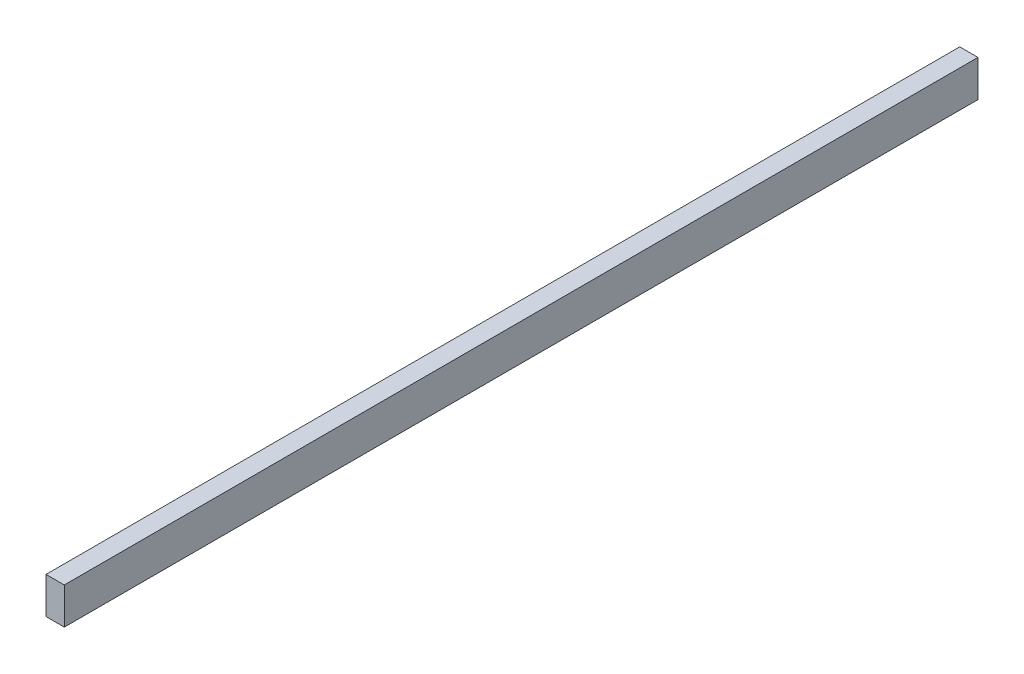
ISO-10303-21;
HEADER;
FILE_DESCRIPTION(('STEP AP214'),'2;1');
FILE_NAME('part.step','',(''),(''),'','','');
FILE_SCHEMA(('AUTOMOTIVE_DESIGN { 1 0 10303 214 1 1 1 1 }'));
ENDSEC;
DATA;
#1=APPLICATION_CONTEXT('core data for automotive mechanical design processes');
#2=APPLICATION_PROTOCOL_DEFINITION('international standard','automotive_design',2000,#1);
#3=PRODUCT_CONTEXT('',#1,'mechanical');
#4=PRODUCT('Part','Part','',(#3));
#5=PRODUCT_RELATED_PRODUCT_CATEGORY('part','',(#4));
#6=PRODUCT_DEFINITION_FORMATION('','',#4);
#7=PRODUCT_DEFINITION_CONTEXT('part definition',#1,'design');
#8=PRODUCT_DEFINITION('design','',#6,#7);
#9=PRODUCT_DEFINITION_SHAPE('','',#8);
#10=(LENGTH_UNIT() NAMED_UNIT(*) SI_UNIT(.MILLI.,.METRE.));
#11=(NAMED_UNIT(*) PLANE_ANGLE_UNIT() SI_UNIT($,.RADIAN.));
#12=(NAMED_UNIT(*) SI_UNIT($,.STERADIAN.) SOLID_ANGLE_UNIT());
#13=UNCERTAINTY_MEASURE_WITH_UNIT(LENGTH_MEASURE(1.E-05),#10,'distance_accuracy_value','');
#14=(GEOMETRIC_REPRESENTATION_CONTEXT(3) GLOBAL_UNCERTAINTY_ASSIGNED_CONTEXT((#13)) GLOBAL_UNIT_ASSIGNED_CONTEXT((#10,
#11,#12)) REPRESENTATION_CONTEXT('',''));
#15=CARTESIAN_POINT('',(0.,0.,0.));
#16=DIRECTION('',(0.,0.,1.));
#17=DIRECTION('',(1.,0.,0.));
#18=AXIS2_PLACEMENT_3D('',#15,#16,#17);
#19=CARTESIAN_POINT('',(20.,-40.,2000.));
#20=DIRECTION('',(-1.,0.,0.));
#21=DIRECTION('',(0.,0.,1.));
#22=AXIS2_PLACEMENT_3D('',#19,#20,#21);
#23=PLANE('',#22);
#24=DIRECTION('',(0.,1.,0.));
#25=VECTOR('',#24,1.);
#26=CARTESIAN_POINT('',(20.,-40.,0.));
#27=LINE('',#26,#25);
#28=CARTESIAN_POINT('',(20.,-40.,0.));
#29=VERTEX_POINT('',#28);
#30=CARTESIAN_POINT('',(20.,40.,0.));
#31=VERTEX_POINT('',#30);
#32=EDGE_CURVE('E101',#29,#31,#27,.T.);
#33=ORIENTED_EDGE('',*,*,#32,.T.);
#34=DIRECTION('',(0.,0.,-1.));
#35=VECTOR('',#34,1.);
#36=CARTESIAN_POINT('',(20.,40.,2000.));
#37=LINE('',#36,#35);
#38=CARTESIAN_POINT('',(20.,40.,2000.));
#39=VERTEX_POINT('',#38);
#40=EDGE_CURVE('E11',#39,#31,#37,.T.);
#41=ORIENTED_EDGE('',*,*,#40,.F.);
#42=DIRECTION('',(0.,1.,0.));
#43=VECTOR('',#42,1.);
#44=CARTESIAN_POINT('',(20.,-40.,2000.));
#45=LINE('',#44,#43);
#46=CARTESIAN_POINT('',(20.,-40.,2000.));
#47=VERTEX_POINT('',#46);
#48=EDGE_CURVE('E95',#47,#39,#45,.T.);
#49=ORIENTED_EDGE('',*,*,#48,.F.);
#50=DIRECTION('',(0.,0.,-1.));
#51=VECTOR('',#50,1.);
#52=CARTESIAN_POINT('',(20.,-40.,2000.));
#53=LINE('',#52,#51);
#54=EDGE_CURVE('E99',#47,#29,#53,.T.);
#55=ORIENTED_EDGE('',*,*,#54,.T.);
#56=EDGE_LOOP('',(#33,#41,#49,#55));
#57=FACE_BOUND('',#56,.T.);
#58=ADVANCED_FACE('F41',(#57),#23,.F.);
#59=CARTESIAN_POINT('',(-20.,40.,2000.));
#60=DIRECTION('',(0.,-1.,0.));
#61=DIRECTION('',(0.,0.,-1.));
#62=AXIS2_PLACEMENT_3D('',#59,#60,#61);
#63=PLANE('',#62);
#64=DIRECTION('',(-1.,0.,0.));
#65=VECTOR('',#64,1.);
#66=CARTESIAN_POINT('',(-20.,40.,0.));
#67=LINE('',#66,#65);
#68=CARTESIAN_POINT('',(-20.,40.,0.));
#69=VERTEX_POINT('',#68);
#70=EDGE_CURVE('E96',#31,#69,#67,.T.);
#71=ORIENTED_EDGE('',*,*,#70,.T.);
#72=DIRECTION('',(0.,0.,-1.));
#73=VECTOR('',#72,1.);
#74=CARTESIAN_POINT('',(-20.,40.,2000.));
#75=LINE('',#74,#73);
#76=CARTESIAN_POINT('',(-20.,40.,2000.));
#77=VERTEX_POINT('',#76);
#78=EDGE_CURVE('E47',#77,#69,#75,.T.);
#79=ORIENTED_EDGE('',*,*,#78,.F.);
#80=DIRECTION('',(-1.,0.,0.));
#81=VECTOR('',#80,1.);
#82=CARTESIAN_POINT('',(-20.,40.,2000.));
#83=LINE('',#82,#81);
#84=EDGE_CURVE('E90',#39,#77,#83,.T.);
#85=ORIENTED_EDGE('',*,*,#84,.F.);
#86=ORIENTED_EDGE('',*,*,#40,.T.);
#87=EDGE_LOOP('',(#71,#79,#85,#86));
#88=FACE_BOUND('',#87,.T.);
#89=ADVANCED_FACE('F94',(#88),#63,.F.);
#90=CARTESIAN_POINT('',(-20.,-40.,2000.));
#91=DIRECTION('',(1.,0.,0.));
#92=DIRECTION('',(0.,0.,-1.));
#93=AXIS2_PLACEMENT_3D('',#90,#91,#92);
#94=PLANE('',#93);
#95=DIRECTION('',(0.,-1.,0.));
#96=VECTOR('',#95,1.);
#97=CARTESIAN_POINT('',(-20.,-40.,0.));
#98=LINE('',#97,#96);
#99=CARTESIAN_POINT('',(-20.,-40.,0.));
#100=VERTEX_POINT('',#99);
#101=EDGE_CURVE('E73',#69,#100,#98,.T.);
#102=ORIENTED_EDGE('',*,*,#101,.T.);
#103=DIRECTION('',(0.,0.,-1.));
#104=VECTOR('',#103,1.);
#105=CARTESIAN_POINT('',(-20.,-40.,2000.));
#106=LINE('',#105,#104);
#107=CARTESIAN_POINT('',(-20.,-40.,2000.));
#108=VERTEX_POINT('',#107);
#109=EDGE_CURVE('E100',#108,#100,#106,.T.);
#110=ORIENTED_EDGE('',*,*,#109,.F.);
#111=DIRECTION('',(0.,-1.,0.));
#112=VECTOR('',#111,1.);
#113=CARTESIAN_POINT('',(-20.,-40.,2000.));
#114=LINE('',#113,#112);
#115=EDGE_CURVE('E89',#77,#108,#114,.T.);
#116=ORIENTED_EDGE('',*,*,#115,.F.);
#117=ORIENTED_EDGE('',*,*,#78,.T.);
#118=EDGE_LOOP('',(#102,#110,#116,#117));
#119=FACE_BOUND('',#118,.T.);
#120=ADVANCED_FACE('F97',(#119),#94,.F.);
#121=CARTESIAN_POINT('',(-20.,-40.,2000.));
#122=DIRECTION('',(0.,1.,0.));
#123=DIRECTION('',(0.,0.,1.));
#124=AXIS2_PLACEMENT_3D('',#121,#122,#123);
#125=PLANE('',#124);
#126=DIRECTION('',(1.,0.,0.));
#127=VECTOR('',#126,1.);
#128=CARTESIAN_POINT('',(-20.,-40.,0.));
#129=LINE('',#128,#127);
#130=EDGE_CURVE('E79',#100,#29,#129,.T.);
#131=ORIENTED_EDGE('',*,*,#130,.T.);
#132=ORIENTED_EDGE('',*,*,#54,.F.);
#133=DIRECTION('',(1.,0.,0.));
#134=VECTOR('',#133,1.);
#135=CARTESIAN_POINT('',(-20.,-40.,2000.));
#136=LINE('',#135,#134);
#137=EDGE_CURVE('E60',#108,#47,#136,.T.);
#138=ORIENTED_EDGE('',*,*,#137,.F.);
#139=ORIENTED_EDGE('',*,*,#109,.T.);
#140=EDGE_LOOP('',(#131,#132,#138,#139));
#141=FACE_BOUND('',#140,.T.);
#142=ADVANCED_FACE('F112',(#141),#125,.F.);
#143=CARTESIAN_POINT('',(0.,0.,2000.));
#144=DIRECTION('',(0.,0.,-1.));
#145=DIRECTION('',(-1.,0.,0.));
#146=AXIS2_PLACEMENT_3D('',#143,#144,#145);
#147=PLANE('',#146);
#148=ORIENTED_EDGE('',*,*,#48,.T.);
#149=ORIENTED_EDGE('',*,*,#84,.T.);
#150=ORIENTED_EDGE('',*,*,#115,.T.);
#151=ORIENTED_EDGE('',*,*,#137,.T.);
#152=EDGE_LOOP('',(#148,#149,#150,#151));
#153=FACE_BOUND('',#152,.T.);
#154=ADVANCED_FACE('F88',(#153),#147,.F.);
#155=CARTESIAN_POINT('',(0.,0.,0.));
#156=DIRECTION('',(0.,0.,-1.));
#157=DIRECTION('',(-1.,0.,0.));
#158=AXIS2_PLACEMENT_3D('',#155,#156,#157);
#159=PLANE('',#158);
#160=ORIENTED_EDGE('',*,*,#32,.F.);
#161=ORIENTED_EDGE('',*,*,#130,.F.);
#162=ORIENTED_EDGE('',*,*,#101,.F.);
#163=ORIENTED_EDGE('',*,*,#70,.F.);
#164=EDGE_LOOP('',(#160,#161,#162,#163));
#165=FACE_BOUND('',#164,.T.);
#166=ADVANCED_FACE('F114',(#165),#159,.T.);
#167=CLOSED_SHELL('',(#58,#89,#120,#142,#154,#166));
#168=MANIFOLD_SOLID_BREP('B2',#167);
#169=ADVANCED_BREP_SHAPE_REPRESENTATION('',(#18,#168),#14);
#170=SHAPE_DEFINITION_REPRESENTATION(#9,#169);
ENDSEC;
END-ISO-10303-21;
